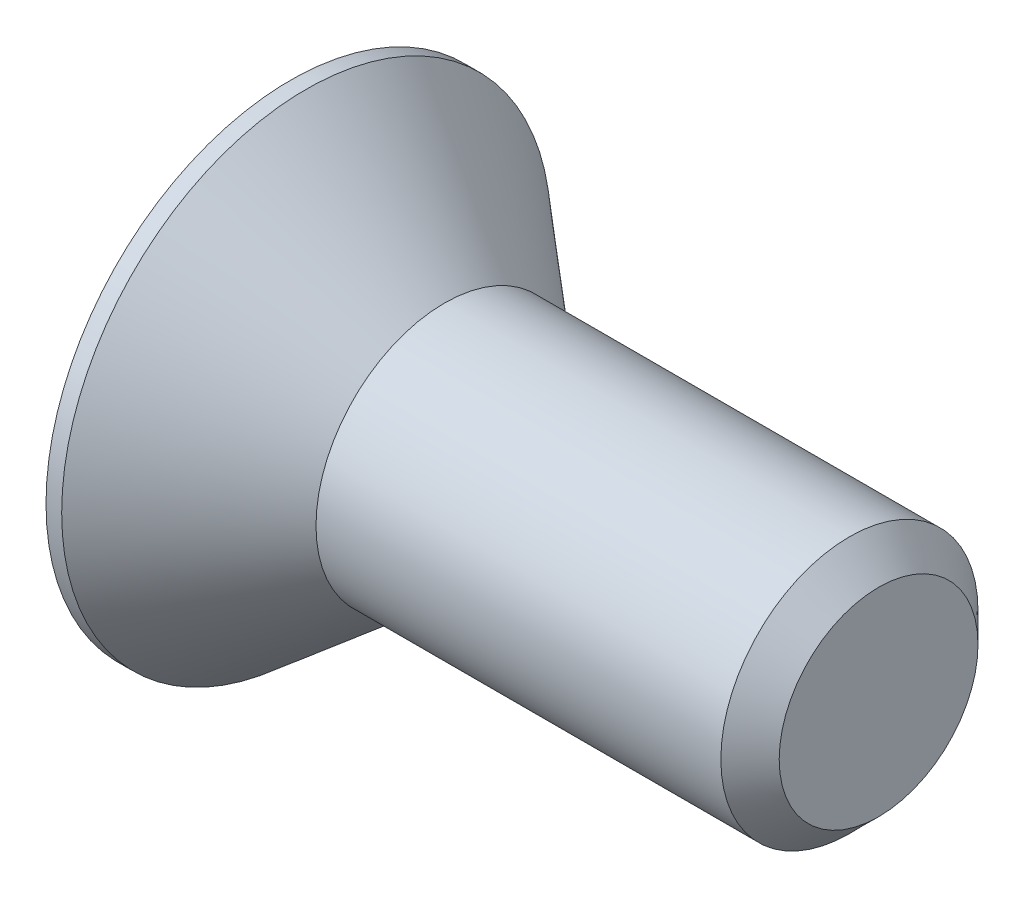
ISO-10303-21;
HEADER;
FILE_DESCRIPTION(('STEP AP214'),'2;1');
FILE_NAME('part.step','',(''),(''),'','','');
FILE_SCHEMA(('AUTOMOTIVE_DESIGN { 1 0 10303 214 1 1 1 1 }'));
ENDSEC;
DATA;
#1=APPLICATION_CONTEXT('core data for automotive mechanical design processes');
#2=APPLICATION_PROTOCOL_DEFINITION('international standard','automotive_design',2000,#1);
#3=PRODUCT_CONTEXT('',#1,'mechanical');
#4=PRODUCT('Part','Part','',(#3));
#5=PRODUCT_RELATED_PRODUCT_CATEGORY('part','',(#4));
#6=PRODUCT_DEFINITION_FORMATION('','',#4);
#7=PRODUCT_DEFINITION_CONTEXT('part definition',#1,'design');
#8=PRODUCT_DEFINITION('design','',#6,#7);
#9=PRODUCT_DEFINITION_SHAPE('','',#8);
#10=(LENGTH_UNIT() NAMED_UNIT(*) SI_UNIT(.MILLI.,.METRE.));
#11=(NAMED_UNIT(*) PLANE_ANGLE_UNIT() SI_UNIT($,.RADIAN.));
#12=(NAMED_UNIT(*) SI_UNIT($,.STERADIAN.) SOLID_ANGLE_UNIT());
#13=UNCERTAINTY_MEASURE_WITH_UNIT(LENGTH_MEASURE(1.E-05),#10,'distance_accuracy_value','');
#14=(GEOMETRIC_REPRESENTATION_CONTEXT(3) GLOBAL_UNCERTAINTY_ASSIGNED_CONTEXT((#13)) GLOBAL_UNIT_ASSIGNED_CONTEXT((#10,
#11,#12)) REPRESENTATION_CONTEXT('',''));
#15=CARTESIAN_POINT('',(0.,0.,0.));
#16=DIRECTION('',(0.,0.,1.));
#17=DIRECTION('',(1.,0.,0.));
#18=AXIS2_PLACEMENT_3D('',#15,#16,#17);
#19=CARTESIAN_POINT('',(-1.65136592745077,-2.3114,0.));
#20=DIRECTION('',(0.,1.,0.));
#21=DIRECTION('',(0.,0.,1.));
#22=AXIS2_PLACEMENT_3D('',#19,#20,#21);
#23=PLANE('',#22);
#24=DIRECTION('',(1.,0.,0.));
#25=VECTOR('',#24,1.);
#26=CARTESIAN_POINT('',(-1.65136592745077,-2.3114,-0.381));
#27=LINE('',#26,#25);
#28=CARTESIAN_POINT('',(-2.54,-2.3114,-0.381));
#29=VERTEX_POINT('',#28);
#30=CARTESIAN_POINT('',(-0.76273185490154,-2.3114,-0.381));
#31=VERTEX_POINT('',#30);
#32=EDGE_CURVE('E198',#29,#31,#27,.T.);
#33=ORIENTED_EDGE('',*,*,#32,.F.);
#34=DIRECTION('',(0.,0.,1.));
#35=VECTOR('',#34,1.);
#36=CARTESIAN_POINT('',(-2.54,-2.3114,0.));
#37=LINE('',#36,#35);
#38=CARTESIAN_POINT('',(-2.54,-2.3114,0.381));
#39=VERTEX_POINT('',#38);
#40=EDGE_CURVE('E144',#29,#39,#37,.T.);
#41=ORIENTED_EDGE('',*,*,#40,.T.);
#42=DIRECTION('',(1.,0.,0.));
#43=VECTOR('',#42,1.);
#44=CARTESIAN_POINT('',(-1.65136592745077,-2.3114,0.381));
#45=LINE('',#44,#43);
#46=CARTESIAN_POINT('',(-0.76273185490154,-2.3114,0.381));
#47=VERTEX_POINT('',#46);
#48=EDGE_CURVE('E202',#39,#47,#45,.T.);
#49=ORIENTED_EDGE('',*,*,#48,.T.);
#50=DIRECTION('',(0.,0.,1.));
#51=VECTOR('',#50,1.);
#52=CARTESIAN_POINT('',(-0.76273185490154,-2.3114,0.));
#53=LINE('',#52,#51);
#54=EDGE_CURVE('E119',#31,#47,#53,.T.);
#55=ORIENTED_EDGE('',*,*,#54,.F.);
#56=EDGE_LOOP('',(#33,#41,#49,#55));
#57=FACE_BOUND('',#56,.T.);
#58=ADVANCED_FACE('F17',(#57),#23,.T.);
#59=CARTESIAN_POINT('',(-1.65136592745077,0.,-2.3114));
#60=DIRECTION('',(0.,0.,1.));
#61=DIRECTION('',(1.,0.,0.));
#62=AXIS2_PLACEMENT_3D('',#59,#60,#61);
#63=PLANE('',#62);
#64=DIRECTION('',(1.,0.,0.));
#65=VECTOR('',#64,1.);
#66=CARTESIAN_POINT('',(-1.65136592745077,-0.381,-2.3114));
#67=LINE('',#66,#65);
#68=CARTESIAN_POINT('',(-0.76273185490154,-0.381,-2.3114));
#69=VERTEX_POINT('',#68);
#70=CARTESIAN_POINT('',(-2.54,-0.381,-2.3114));
#71=VERTEX_POINT('',#70);
#72=EDGE_CURVE('E189',#69,#71,#67,.F.);
#73=ORIENTED_EDGE('',*,*,#72,.F.);
#74=DIRECTION('',(0.,1.,0.));
#75=VECTOR('',#74,1.);
#76=CARTESIAN_POINT('',(-0.76273185490154,0.,-2.3114));
#77=LINE('',#76,#75);
#78=CARTESIAN_POINT('',(-0.76273185490154,0.381,-2.3114));
#79=VERTEX_POINT('',#78);
#80=EDGE_CURVE('E136',#79,#69,#77,.F.);
#81=ORIENTED_EDGE('',*,*,#80,.F.);
#82=DIRECTION('',(1.,0.,0.));
#83=VECTOR('',#82,1.);
#84=CARTESIAN_POINT('',(-1.65136592745077,0.381,-2.3114));
#85=LINE('',#84,#83);
#86=CARTESIAN_POINT('',(-2.54,0.381,-2.3114));
#87=VERTEX_POINT('',#86);
#88=EDGE_CURVE('E183',#87,#79,#85,.T.);
#89=ORIENTED_EDGE('',*,*,#88,.F.);
#90=DIRECTION('',(0.,1.,0.));
#91=VECTOR('',#90,1.);
#92=CARTESIAN_POINT('',(-2.54,0.,-2.3114));
#93=LINE('',#92,#91);
#94=EDGE_CURVE('E142',#87,#71,#93,.F.);
#95=ORIENTED_EDGE('',*,*,#94,.T.);
#96=EDGE_LOOP('',(#73,#81,#89,#95));
#97=FACE_BOUND('',#96,.T.);
#98=ADVANCED_FACE('F253',(#97),#63,.T.);
#99=CARTESIAN_POINT('',(-1.65136592745077,2.3114,0.));
#100=DIRECTION('',(0.,-1.,0.));
#101=DIRECTION('',(0.,0.,-1.));
#102=AXIS2_PLACEMENT_3D('',#99,#100,#101);
#103=PLANE('',#102);
#104=DIRECTION('',(1.,0.,0.));
#105=VECTOR('',#104,1.);
#106=CARTESIAN_POINT('',(-1.65136592745077,2.3114,-0.381));
#107=LINE('',#106,#105);
#108=CARTESIAN_POINT('',(-0.76273185490154,2.3114,-0.381));
#109=VERTEX_POINT('',#108);
#110=CARTESIAN_POINT('',(-2.54,2.3114,-0.381));
#111=VERTEX_POINT('',#110);
#112=EDGE_CURVE('E174',#109,#111,#107,.F.);
#113=ORIENTED_EDGE('',*,*,#112,.F.);
#114=DIRECTION('',(0.,0.,1.));
#115=VECTOR('',#114,1.);
#116=CARTESIAN_POINT('',(-0.76273185490154,2.3114,0.));
#117=LINE('',#116,#115);
#118=CARTESIAN_POINT('',(-0.76273185490154,2.3114,0.381));
#119=VERTEX_POINT('',#118);
#120=EDGE_CURVE('E138',#119,#109,#117,.F.);
#121=ORIENTED_EDGE('',*,*,#120,.F.);
#122=DIRECTION('',(1.,0.,0.));
#123=VECTOR('',#122,1.);
#124=CARTESIAN_POINT('',(-1.65136592745077,2.3114,0.381));
#125=LINE('',#124,#123);
#126=CARTESIAN_POINT('',(-2.54,2.3114,0.381));
#127=VERTEX_POINT('',#126);
#128=EDGE_CURVE('E165',#119,#127,#125,.F.);
#129=ORIENTED_EDGE('',*,*,#128,.T.);
#130=DIRECTION('',(0.,0.,-1.));
#131=VECTOR('',#130,1.);
#132=CARTESIAN_POINT('',(-2.54,2.3114,0.));
#133=LINE('',#132,#131);
#134=EDGE_CURVE('E140',#127,#111,#133,.T.);
#135=ORIENTED_EDGE('',*,*,#134,.T.);
#136=EDGE_LOOP('',(#113,#121,#129,#135));
#137=FACE_BOUND('',#136,.T.);
#138=ADVANCED_FACE('F222',(#137),#103,.T.);
#139=CARTESIAN_POINT('',(-0.76273185490154,0.,0.));
#140=DIRECTION('',(-1.,0.,0.));
#141=DIRECTION('',(0.,0.,1.));
#142=AXIS2_PLACEMENT_3D('',#139,#140,#141);
#143=PLANE('',#142);
#144=DIRECTION('',(0.,0.,-1.));
#145=VECTOR('',#144,1.);
#146=CARTESIAN_POINT('',(-0.76273185490154,0.381,0.));
#147=LINE('',#146,#145);
#148=CARTESIAN_POINT('',(-0.76273185490154,0.381,0.381));
#149=VERTEX_POINT('',#148);
#150=CARTESIAN_POINT('',(-0.76273185490154,0.381,2.3114));
#151=VERTEX_POINT('',#150);
#152=EDGE_CURVE('E163',#149,#151,#147,.F.);
#153=ORIENTED_EDGE('',*,*,#152,.F.);
#154=DIRECTION('',(0.,1.,0.));
#155=VECTOR('',#154,1.);
#156=CARTESIAN_POINT('',(-0.76273185490154,0.,0.381));
#157=LINE('',#156,#155);
#158=EDGE_CURVE('E168',#149,#119,#157,.T.);
#159=ORIENTED_EDGE('',*,*,#158,.T.);
#160=ORIENTED_EDGE('',*,*,#120,.T.);
#161=DIRECTION('',(0.,1.,0.));
#162=VECTOR('',#161,1.);
#163=CARTESIAN_POINT('',(-0.76273185490154,0.,-0.381));
#164=LINE('',#163,#162);
#165=CARTESIAN_POINT('',(-0.76273185490154,0.381,-0.381));
#166=VERTEX_POINT('',#165);
#167=EDGE_CURVE('E177',#166,#109,#164,.T.);
#168=ORIENTED_EDGE('',*,*,#167,.F.);
#169=DIRECTION('',(0.,0.,-1.));
#170=VECTOR('',#169,1.);
#171=CARTESIAN_POINT('',(-0.76273185490154,0.381,0.));
#172=LINE('',#171,#170);
#173=EDGE_CURVE('E180',#79,#166,#172,.F.);
#174=ORIENTED_EDGE('',*,*,#173,.F.);
#175=ORIENTED_EDGE('',*,*,#80,.T.);
#176=DIRECTION('',(0.,0.,1.));
#177=VECTOR('',#176,1.);
#178=CARTESIAN_POINT('',(-0.76273185490154,-0.381,0.));
#179=LINE('',#178,#177);
#180=CARTESIAN_POINT('',(-0.76273185490154,-0.381,-0.381));
#181=VERTEX_POINT('',#180);
#182=EDGE_CURVE('E192',#181,#69,#179,.F.);
#183=ORIENTED_EDGE('',*,*,#182,.F.);
#184=DIRECTION('',(0.,1.,0.));
#185=VECTOR('',#184,1.);
#186=CARTESIAN_POINT('',(-0.76273185490154,0.,-0.381));
#187=LINE('',#186,#185);
#188=EDGE_CURVE('E195',#31,#181,#187,.T.);
#189=ORIENTED_EDGE('',*,*,#188,.F.);
#190=ORIENTED_EDGE('',*,*,#54,.T.);
#191=DIRECTION('',(0.,1.,0.));
#192=VECTOR('',#191,1.);
#193=CARTESIAN_POINT('',(-0.76273185490154,0.,0.381));
#194=LINE('',#193,#192);
#195=CARTESIAN_POINT('',(-0.76273185490154,-0.381,0.381));
#196=VERTEX_POINT('',#195);
#197=EDGE_CURVE('E124',#47,#196,#194,.T.);
#198=ORIENTED_EDGE('',*,*,#197,.T.);
#199=DIRECTION('',(0.,0.,1.));
#200=VECTOR('',#199,1.);
#201=CARTESIAN_POINT('',(-0.76273185490154,-0.381,0.));
#202=LINE('',#201,#200);
#203=CARTESIAN_POINT('',(-0.76273185490154,-0.381,2.3114));
#204=VERTEX_POINT('',#203);
#205=EDGE_CURVE('E104',#204,#196,#202,.F.);
#206=ORIENTED_EDGE('',*,*,#205,.F.);
#207=DIRECTION('',(0.,1.,0.));
#208=VECTOR('',#207,1.);
#209=CARTESIAN_POINT('',(-0.76273185490154,0.,2.3114));
#210=LINE('',#209,#208);
#211=EDGE_CURVE('E110',#204,#151,#210,.T.);
#212=ORIENTED_EDGE('',*,*,#211,.T.);
#213=EDGE_LOOP('',(#153,#159,#160,#168,#174,#175,#183,#189,#190,#198,#206,#212));
#214=FACE_BOUND('',#213,.T.);
#215=ADVANCED_FACE('F121',(#214),#143,.T.);
#216=CARTESIAN_POINT('',(-1.65136592745077,0.,2.3114));
#217=DIRECTION('',(0.,0.,1.));
#218=DIRECTION('',(1.,0.,0.));
#219=AXIS2_PLACEMENT_3D('',#216,#217,#218);
#220=PLANE('',#219);
#221=DIRECTION('',(0.,1.,0.));
#222=VECTOR('',#221,1.);
#223=CARTESIAN_POINT('',(-2.54,0.,2.3114));
#224=LINE('',#223,#222);
#225=CARTESIAN_POINT('',(-2.54,0.381,2.3114));
#226=VERTEX_POINT('',#225);
#227=CARTESIAN_POINT('',(-2.54,-0.381,2.3114));
#228=VERTEX_POINT('',#227);
#229=EDGE_CURVE('E118',#226,#228,#224,.F.);
#230=ORIENTED_EDGE('',*,*,#229,.F.);
#231=DIRECTION('',(1.,0.,0.));
#232=VECTOR('',#231,1.);
#233=CARTESIAN_POINT('',(-1.65136592745077,0.381,2.3114));
#234=LINE('',#233,#232);
#235=EDGE_CURVE('E115',#151,#226,#234,.F.);
#236=ORIENTED_EDGE('',*,*,#235,.F.);
#237=ORIENTED_EDGE('',*,*,#211,.F.);
#238=DIRECTION('',(1.,0.,0.));
#239=VECTOR('',#238,1.);
#240=CARTESIAN_POINT('',(-1.65136592745077,-0.381,2.3114));
#241=LINE('',#240,#239);
#242=EDGE_CURVE('E112',#228,#204,#241,.T.);
#243=ORIENTED_EDGE('',*,*,#242,.F.);
#244=EDGE_LOOP('',(#230,#236,#237,#243));
#245=FACE_BOUND('',#244,.T.);
#246=ADVANCED_FACE('F111',(#245),#220,.F.);
#247=CARTESIAN_POINT('',(-1.65136592745077,-0.381,0.));
#248=DIRECTION('',(0.,1.,0.));
#249=DIRECTION('',(0.,0.,1.));
#250=AXIS2_PLACEMENT_3D('',#247,#248,#249);
#251=PLANE('',#250);
#252=ORIENTED_EDGE('',*,*,#205,.T.);
#253=DIRECTION('',(1.,0.,0.));
#254=VECTOR('',#253,1.);
#255=CARTESIAN_POINT('',(-1.65136592745077,-0.381,0.381));
#256=LINE('',#255,#254);
#257=CARTESIAN_POINT('',(-2.54,-0.381,0.381));
#258=VERTEX_POINT('',#257);
#259=EDGE_CURVE('E126',#196,#258,#256,.F.);
#260=ORIENTED_EDGE('',*,*,#259,.T.);
#261=DIRECTION('',(0.,0.,1.));
#262=VECTOR('',#261,1.);
#263=CARTESIAN_POINT('',(-2.54,-0.381,1.9812));
#264=LINE('',#263,#262);
#265=EDGE_CURVE('E130',#228,#258,#264,.F.);
#266=ORIENTED_EDGE('',*,*,#265,.F.);
#267=ORIENTED_EDGE('',*,*,#242,.T.);
#268=EDGE_LOOP('',(#252,#260,#266,#267));
#269=FACE_BOUND('',#268,.T.);
#270=ADVANCED_FACE('F128',(#269),#251,.T.);
#271=CARTESIAN_POINT('',(-1.65136592745077,0.,0.381));
#272=DIRECTION('',(0.,0.,1.));
#273=DIRECTION('',(1.,0.,0.));
#274=AXIS2_PLACEMENT_3D('',#271,#272,#273);
#275=PLANE('',#274);
#276=ORIENTED_EDGE('',*,*,#48,.F.);
#277=DIRECTION('',(0.,1.,0.));
#278=VECTOR('',#277,1.);
#279=CARTESIAN_POINT('',(-2.54,0.,0.381));
#280=LINE('',#279,#278);
#281=EDGE_CURVE('E207',#258,#39,#280,.F.);
#282=ORIENTED_EDGE('',*,*,#281,.F.);
#283=ORIENTED_EDGE('',*,*,#259,.F.);
#284=ORIENTED_EDGE('',*,*,#197,.F.);
#285=EDGE_LOOP('',(#276,#282,#283,#284));
#286=FACE_BOUND('',#285,.T.);
#287=ADVANCED_FACE('F208',(#286),#275,.F.);
#288=CARTESIAN_POINT('',(-1.65136592745077,0.,-0.381));
#289=DIRECTION('',(0.,0.,1.));
#290=DIRECTION('',(1.,0.,0.));
#291=AXIS2_PLACEMENT_3D('',#288,#289,#290);
#292=PLANE('',#291);
#293=ORIENTED_EDGE('',*,*,#188,.T.);
#294=DIRECTION('',(1.,0.,0.));
#295=VECTOR('',#294,1.);
#296=CARTESIAN_POINT('',(-1.65136592745077,-0.381,-0.381));
#297=LINE('',#296,#295);
#298=CARTESIAN_POINT('',(-2.54,-0.381,-0.381));
#299=VERTEX_POINT('',#298);
#300=EDGE_CURVE('E186',#299,#181,#297,.T.);
#301=ORIENTED_EDGE('',*,*,#300,.F.);
#302=DIRECTION('',(0.,1.,0.));
#303=VECTOR('',#302,1.);
#304=CARTESIAN_POINT('',(-2.54,0.,-0.381));
#305=LINE('',#304,#303);
#306=EDGE_CURVE('E210',#29,#299,#305,.T.);
#307=ORIENTED_EDGE('',*,*,#306,.F.);
#308=ORIENTED_EDGE('',*,*,#32,.T.);
#309=EDGE_LOOP('',(#293,#301,#307,#308));
#310=FACE_BOUND('',#309,.T.);
#311=ADVANCED_FACE('F247',(#310),#292,.T.);
#312=CARTESIAN_POINT('',(-1.65136592745077,-0.381,0.));
#313=DIRECTION('',(0.,1.,0.));
#314=DIRECTION('',(0.,0.,1.));
#315=AXIS2_PLACEMENT_3D('',#312,#313,#314);
#316=PLANE('',#315);
#317=DIRECTION('',(0.,0.,1.));
#318=VECTOR('',#317,1.);
#319=CARTESIAN_POINT('',(-2.54,-0.381,1.9812));
#320=LINE('',#319,#318);
#321=EDGE_CURVE('E237',#299,#71,#320,.F.);
#322=ORIENTED_EDGE('',*,*,#321,.F.);
#323=ORIENTED_EDGE('',*,*,#300,.T.);
#324=ORIENTED_EDGE('',*,*,#182,.T.);
#325=ORIENTED_EDGE('',*,*,#72,.T.);
#326=EDGE_LOOP('',(#322,#323,#324,#325));
#327=FACE_BOUND('',#326,.T.);
#328=ADVANCED_FACE('F250',(#327),#316,.T.);
#329=CARTESIAN_POINT('',(-1.65136592745077,0.381,0.));
#330=DIRECTION('',(0.,-1.,0.));
#331=DIRECTION('',(0.,0.,-1.));
#332=AXIS2_PLACEMENT_3D('',#329,#330,#331);
#333=PLANE('',#332);
#334=ORIENTED_EDGE('',*,*,#173,.T.);
#335=DIRECTION('',(1.,0.,0.));
#336=VECTOR('',#335,1.);
#337=CARTESIAN_POINT('',(-1.65136592745077,0.381,-0.381));
#338=LINE('',#337,#336);
#339=CARTESIAN_POINT('',(-2.54,0.381,-0.381));
#340=VERTEX_POINT('',#339);
#341=EDGE_CURVE('E171',#340,#166,#338,.T.);
#342=ORIENTED_EDGE('',*,*,#341,.F.);
#343=DIRECTION('',(0.,0.,1.));
#344=VECTOR('',#343,1.);
#345=CARTESIAN_POINT('',(-2.54,0.381,1.9812));
#346=LINE('',#345,#344);
#347=EDGE_CURVE('E234',#87,#340,#346,.T.);
#348=ORIENTED_EDGE('',*,*,#347,.F.);
#349=ORIENTED_EDGE('',*,*,#88,.T.);
#350=EDGE_LOOP('',(#334,#342,#348,#349));
#351=FACE_BOUND('',#350,.T.);
#352=ADVANCED_FACE('F226',(#351),#333,.T.);
#353=CARTESIAN_POINT('',(-1.65136592745077,0.,-0.381));
#354=DIRECTION('',(0.,0.,1.));
#355=DIRECTION('',(1.,0.,0.));
#356=AXIS2_PLACEMENT_3D('',#353,#354,#355);
#357=PLANE('',#356);
#358=DIRECTION('',(0.,1.,0.));
#359=VECTOR('',#358,1.);
#360=CARTESIAN_POINT('',(-2.54,0.,-0.381));
#361=LINE('',#360,#359);
#362=EDGE_CURVE('E232',#340,#111,#361,.T.);
#363=ORIENTED_EDGE('',*,*,#362,.F.);
#364=ORIENTED_EDGE('',*,*,#341,.T.);
#365=ORIENTED_EDGE('',*,*,#167,.T.);
#366=ORIENTED_EDGE('',*,*,#112,.T.);
#367=EDGE_LOOP('',(#363,#364,#365,#366));
#368=FACE_BOUND('',#367,.T.);
#369=ADVANCED_FACE('F230',(#368),#357,.T.);
#370=CARTESIAN_POINT('',(-1.65136592745077,0.,0.381));
#371=DIRECTION('',(0.,0.,1.));
#372=DIRECTION('',(1.,0.,0.));
#373=AXIS2_PLACEMENT_3D('',#370,#371,#372);
#374=PLANE('',#373);
#375=ORIENTED_EDGE('',*,*,#128,.F.);
#376=ORIENTED_EDGE('',*,*,#158,.F.);
#377=DIRECTION('',(1.,0.,0.));
#378=VECTOR('',#377,1.);
#379=CARTESIAN_POINT('',(-1.65136592745077,0.381,0.381));
#380=LINE('',#379,#378);
#381=CARTESIAN_POINT('',(-2.54,0.381,0.381));
#382=VERTEX_POINT('',#381);
#383=EDGE_CURVE('E35',#382,#149,#380,.T.);
#384=ORIENTED_EDGE('',*,*,#383,.F.);
#385=DIRECTION('',(0.,1.,0.));
#386=VECTOR('',#385,1.);
#387=CARTESIAN_POINT('',(-2.54,0.,0.381));
#388=LINE('',#387,#386);
#389=EDGE_CURVE('E219',#127,#382,#388,.F.);
#390=ORIENTED_EDGE('',*,*,#389,.F.);
#391=EDGE_LOOP('',(#375,#376,#384,#390));
#392=FACE_BOUND('',#391,.T.);
#393=ADVANCED_FACE('F218',(#392),#374,.F.);
#394=CARTESIAN_POINT('',(-1.65136592745077,0.381,0.));
#395=DIRECTION('',(0.,-1.,0.));
#396=DIRECTION('',(0.,0.,-1.));
#397=AXIS2_PLACEMENT_3D('',#394,#395,#396);
#398=PLANE('',#397);
#399=DIRECTION('',(0.,0.,1.));
#400=VECTOR('',#399,1.);
#401=CARTESIAN_POINT('',(-2.54,0.381,1.9812));
#402=LINE('',#401,#400);
#403=EDGE_CURVE('E157',#382,#226,#402,.T.);
#404=ORIENTED_EDGE('',*,*,#403,.F.);
#405=ORIENTED_EDGE('',*,*,#383,.T.);
#406=ORIENTED_EDGE('',*,*,#152,.T.);
#407=ORIENTED_EDGE('',*,*,#235,.T.);
#408=EDGE_LOOP('',(#404,#405,#406,#407));
#409=FACE_BOUND('',#408,.T.);
#410=ADVANCED_FACE('F216',(#409),#398,.T.);
#411=CARTESIAN_POINT('',(-2.54,0.,1.9812));
#412=DIRECTION('',(-1.,0.,0.));
#413=DIRECTION('',(0.,0.,1.));
#414=AXIS2_PLACEMENT_3D('',#411,#412,#413);
#415=PLANE('',#414);
#416=ORIENTED_EDGE('',*,*,#389,.T.);
#417=ORIENTED_EDGE('',*,*,#403,.T.);
#418=ORIENTED_EDGE('',*,*,#229,.T.);
#419=ORIENTED_EDGE('',*,*,#265,.T.);
#420=ORIENTED_EDGE('',*,*,#281,.T.);
#421=ORIENTED_EDGE('',*,*,#40,.F.);
#422=ORIENTED_EDGE('',*,*,#306,.T.);
#423=ORIENTED_EDGE('',*,*,#321,.T.);
#424=ORIENTED_EDGE('',*,*,#94,.F.);
#425=ORIENTED_EDGE('',*,*,#347,.T.);
#426=ORIENTED_EDGE('',*,*,#362,.T.);
#427=ORIENTED_EDGE('',*,*,#134,.F.);
#428=EDGE_LOOP('',(#416,#417,#418,#419,#420,#421,#422,#423,#424,#425,#426,#427));
#429=FACE_BOUND('',#428,.T.);
#430=CARTESIAN_POINT('',(-2.54,0.,0.));
#431=DIRECTION('',(1.,0.,0.));
#432=DIRECTION('',(0.,0.,-1.));
#433=AXIS2_PLACEMENT_3D('',#430,#431,#432);
#434=CIRCLE('',#433,3.9624);
#435=CARTESIAN_POINT('',(-2.54,0.,-3.9624));
#436=VERTEX_POINT('',#435);
#437=EDGE_CURVE('E20',#436,#436,#434,.T.);
#438=ORIENTED_EDGE('',*,*,#437,.F.);
#439=EDGE_LOOP('',(#438));
#440=FACE_BOUND('',#439,.T.);
#441=ADVANCED_FACE('F212',(#429,#440),#415,.T.);
#442=CARTESIAN_POINT('',(-2.413,0.,0.));
#443=DIRECTION('',(1.,0.,0.));
#444=DIRECTION('',(0.,0.,-1.));
#445=AXIS2_PLACEMENT_3D('',#442,#443,#444);
#446=CYLINDRICAL_SURFACE('',#445,3.9624);
#447=ORIENTED_EDGE('',*,*,#437,.T.);
#448=EDGE_LOOP('',(#447));
#449=FACE_BOUND('',#448,.T.);
#450=CARTESIAN_POINT('',(-2.28599999996959,0.,0.));
#451=DIRECTION('',(-1.,0.,0.));
#452=DIRECTION('',(0.,0.,1.));
#453=AXIS2_PLACEMENT_3D('',#450,#451,#452);
#454=CIRCLE('',#453,3.96239999997761);
#455=CARTESIAN_POINT('',(-2.28599999996959,0.,3.96239999997761));
#456=VERTEX_POINT('',#455);
#457=EDGE_CURVE('E147',#456,#456,#454,.F.);
#458=ORIENTED_EDGE('',*,*,#457,.F.);
#459=EDGE_LOOP('',(#458));
#460=FACE_BOUND('',#459,.T.);
#461=ADVANCED_FACE('F278',(#449,#460),#446,.T.);
#462=CARTESIAN_POINT('',(6.985,0.,-1.0414));
#463=DIRECTION('',(1.,0.,0.));
#464=DIRECTION('',(0.,0.,-1.));
#465=AXIS2_PLACEMENT_3D('',#462,#463,#464);
#466=PLANE('',#465);
#467=CARTESIAN_POINT('',(6.98499999998603,0.,0.));
#468=DIRECTION('',(-1.,0.,0.));
#469=DIRECTION('',(0.,0.,1.));
#470=AXIS2_PLACEMENT_3D('',#467,#468,#469);
#471=CIRCLE('',#470,1.61036000002923);
#472=CARTESIAN_POINT('',(6.98499999998603,0.,1.61036000002923));
#473=VERTEX_POINT('',#472);
#474=EDGE_CURVE('E145',#473,#473,#471,.T.);
#475=ORIENTED_EDGE('',*,*,#474,.F.);
#476=EDGE_LOOP('',(#475));
#477=FACE_BOUND('',#476,.T.);
#478=ADVANCED_FACE('F275',(#477),#466,.T.);
#479=CARTESIAN_POINT('',(-2.28599999991275,0.,0.));
#480=DIRECTION('',(-1.,0.,0.));
#481=DIRECTION('',(0.,0.,1.));
#482=AXIS2_PLACEMENT_3D('',#479,#480,#481);
#483=CONICAL_SURFACE('',#482,3.96239999992076,0.698131700802206);
#484=ORIENTED_EDGE('',*,*,#457,.T.);
#485=EDGE_LOOP('',(#484));
#486=FACE_BOUND('',#485,.T.);
#487=CARTESIAN_POINT('',(-0.0459799473598605,0.,0.));
#488=DIRECTION('',(-1.,0.,0.));
#489=DIRECTION('',(0.,0.,1.));
#490=AXIS2_PLACEMENT_3D('',#487,#488,#489);
#491=CIRCLE('',#490,2.0828);
#492=CARTESIAN_POINT('',(-0.0459799473598605,0.,2.0828));
#493=VERTEX_POINT('',#492);
#494=EDGE_CURVE('E26',#493,#493,#491,.F.);
#495=ORIENTED_EDGE('',*,*,#494,.F.);
#496=EDGE_LOOP('',(#495));
#497=FACE_BOUND('',#496,.T.);
#498=ADVANCED_FACE('F268',(#486,#497),#483,.T.);
#499=CARTESIAN_POINT('',(6.51256000014655,0.,0.));
#500=DIRECTION('',(-1.,0.,0.));
#501=DIRECTION('',(0.,0.,1.));
#502=AXIS2_PLACEMENT_3D('',#499,#500,#501);
#503=CONICAL_SURFACE('',#502,2.08279999986871,0.785398163397448);
#504=CARTESIAN_POINT('',(6.51256,0.,0.));
#505=DIRECTION('',(-1.,0.,0.));
#506=DIRECTION('',(0.,0.,1.));
#507=AXIS2_PLACEMENT_3D('',#504,#505,#506);
#508=CIRCLE('',#507,2.0828);
#509=CARTESIAN_POINT('',(6.51256,0.,2.0828));
#510=VERTEX_POINT('',#509);
#511=EDGE_CURVE('E11',#510,#510,#508,.T.);
#512=ORIENTED_EDGE('',*,*,#511,.F.);
#513=EDGE_LOOP('',(#512));
#514=FACE_BOUND('',#513,.T.);
#515=ORIENTED_EDGE('',*,*,#474,.T.);
#516=EDGE_LOOP('',(#515));
#517=FACE_BOUND('',#516,.T.);
#518=ADVANCED_FACE('F262',(#514,#517),#503,.T.);
#519=CARTESIAN_POINT('',(3.4925,0.,0.));
#520=DIRECTION('',(-1.,0.,0.));
#521=DIRECTION('',(0.,0.,1.));
#522=AXIS2_PLACEMENT_3D('',#519,#520,#521);
#523=CYLINDRICAL_SURFACE('',#522,2.0828);
#524=ORIENTED_EDGE('',*,*,#511,.T.);
#525=EDGE_LOOP('',(#524));
#526=FACE_BOUND('',#525,.T.);
#527=ORIENTED_EDGE('',*,*,#494,.T.);
#528=EDGE_LOOP('',(#527));
#529=FACE_BOUND('',#528,.T.);
#530=ADVANCED_FACE('F260',(#526,#529),#523,.T.);
#531=CLOSED_SHELL('',(#58,#98,#138,#215,#246,#270,#287,#311,#328,#352,#369,#393,#410,#441,#461,
#478,#498,#518,#530));
#532=MANIFOLD_SOLID_BREP('B1',#531);
#533=ADVANCED_BREP_SHAPE_REPRESENTATION('',(#18,#532),#14);
#534=SHAPE_DEFINITION_REPRESENTATION(#9,#533);
ENDSEC;
END-ISO-10303-21;
